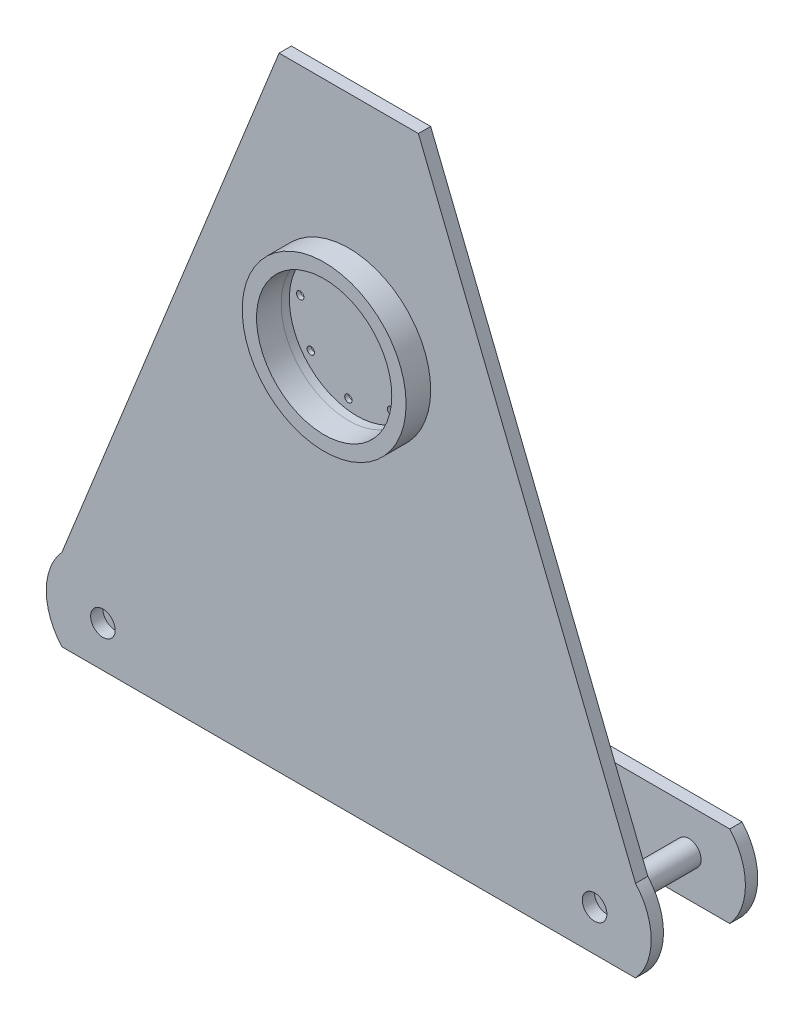
ISO-10303-21;
HEADER;
FILE_DESCRIPTION(('STEP AP214'),'2;1');
FILE_NAME('part.step','',(''),(''),'','','');
FILE_SCHEMA(('AUTOMOTIVE_DESIGN { 1 0 10303 214 1 1 1 1 }'));
ENDSEC;
DATA;
#1=APPLICATION_CONTEXT('core data for automotive mechanical design processes');
#2=APPLICATION_PROTOCOL_DEFINITION('international standard','automotive_design',2000,#1);
#3=PRODUCT_CONTEXT('',#1,'mechanical');
#4=PRODUCT('Part','Part','',(#3));
#5=PRODUCT_RELATED_PRODUCT_CATEGORY('part','',(#4));
#6=PRODUCT_DEFINITION_FORMATION('','',#4);
#7=PRODUCT_DEFINITION_CONTEXT('part definition',#1,'design');
#8=PRODUCT_DEFINITION('design','',#6,#7);
#9=PRODUCT_DEFINITION_SHAPE('','',#8);
#10=(LENGTH_UNIT() NAMED_UNIT(*) SI_UNIT(.MILLI.,.METRE.));
#11=(NAMED_UNIT(*) PLANE_ANGLE_UNIT() SI_UNIT($,.RADIAN.));
#12=(NAMED_UNIT(*) SI_UNIT($,.STERADIAN.) SOLID_ANGLE_UNIT());
#13=UNCERTAINTY_MEASURE_WITH_UNIT(LENGTH_MEASURE(1.E-05),#10,'distance_accuracy_value','');
#14=(GEOMETRIC_REPRESENTATION_CONTEXT(3) GLOBAL_UNCERTAINTY_ASSIGNED_CONTEXT((#13)) GLOBAL_UNIT_ASSIGNED_CONTEXT((#10,
#11,#12)) REPRESENTATION_CONTEXT('',''));
#15=CARTESIAN_POINT('',(0.,0.,0.));
#16=DIRECTION('',(0.,0.,1.));
#17=DIRECTION('',(1.,0.,0.));
#18=AXIS2_PLACEMENT_3D('',#15,#16,#17);
#19=CARTESIAN_POINT('',(0.,446.48,160.));
#20=DIRECTION('',(0.,0.,1.));
#21=DIRECTION('',(1.,0.,0.));
#22=AXIS2_PLACEMENT_3D('',#19,#20,#21);
#23=PLANE('',#22);
#24=CARTESIAN_POINT('',(0.,446.48,160.));
#25=DIRECTION('',(0.,0.,1.));
#26=DIRECTION('',(1.,0.,0.));
#27=AXIS2_PLACEMENT_3D('',#24,#25,#26);
#28=CIRCLE('',#27,100.);
#29=CARTESIAN_POINT('',(100.,446.48,160.));
#30=VERTEX_POINT('',#29);
#31=EDGE_CURVE('E11',#30,#30,#28,.T.);
#32=ORIENTED_EDGE('',*,*,#31,.T.);
#33=EDGE_LOOP('',(#32));
#34=FACE_BOUND('',#33,.T.);
#35=CARTESIAN_POINT('',(0.,446.48,160.));
#36=DIRECTION('',(0.,0.,1.));
#37=DIRECTION('',(1.,0.,0.));
#38=AXIS2_PLACEMENT_3D('',#35,#36,#37);
#39=CIRCLE('',#38,82.5);
#40=CARTESIAN_POINT('',(82.5,446.48,160.));
#41=VERTEX_POINT('',#40);
#42=EDGE_CURVE('E60',#41,#41,#39,.T.);
#43=ORIENTED_EDGE('',*,*,#42,.F.);
#44=EDGE_LOOP('',(#43));
#45=FACE_BOUND('',#44,.T.);
#46=ADVANCED_FACE('F49',(#34,#45),#23,.T.);
#47=CARTESIAN_POINT('',(0.,446.48,130.));
#48=DIRECTION('',(0.,0.,1.));
#49=DIRECTION('',(1.,0.,0.));
#50=AXIS2_PLACEMENT_3D('',#47,#48,#49);
#51=PLANE('',#50);
#52=CARTESIAN_POINT('',(0.,446.48,130.));
#53=DIRECTION('',(0.,0.,1.));
#54=DIRECTION('',(1.,0.,0.));
#55=AXIS2_PLACEMENT_3D('',#52,#53,#54);
#56=CIRCLE('',#55,100.);
#57=CARTESIAN_POINT('',(100.,446.48,130.));
#58=VERTEX_POINT('',#57);
#59=EDGE_CURVE('E53',#58,#58,#56,.T.);
#60=ORIENTED_EDGE('',*,*,#59,.F.);
#61=EDGE_LOOP('',(#60));
#62=FACE_BOUND('',#61,.T.);
#63=CARTESIAN_POINT('',(0.,446.48,130.));
#64=DIRECTION('',(0.,0.,1.));
#65=DIRECTION('',(1.,0.,0.));
#66=AXIS2_PLACEMENT_3D('',#63,#64,#65);
#67=CIRCLE('',#66,82.5);
#68=CARTESIAN_POINT('',(82.5,446.48,130.));
#69=VERTEX_POINT('',#68);
#70=EDGE_CURVE('E62',#69,#69,#67,.T.);
#71=ORIENTED_EDGE('',*,*,#70,.T.);
#72=EDGE_LOOP('',(#71));
#73=FACE_BOUND('',#72,.T.);
#74=ADVANCED_FACE('F72',(#62,#73),#51,.F.);
#75=CARTESIAN_POINT('',(0.,446.48,160.));
#76=DIRECTION('',(0.,0.,-1.));
#77=DIRECTION('',(-1.,0.,0.));
#78=AXIS2_PLACEMENT_3D('',#75,#76,#77);
#79=CYLINDRICAL_SURFACE('',#78,100.);
#80=ORIENTED_EDGE('',*,*,#31,.F.);
#81=EDGE_LOOP('',(#80));
#82=FACE_BOUND('',#81,.T.);
#83=ORIENTED_EDGE('',*,*,#59,.T.);
#84=EDGE_LOOP('',(#83));
#85=FACE_BOUND('',#84,.T.);
#86=ADVANCED_FACE('F51',(#82,#85),#79,.T.);
#87=CARTESIAN_POINT('',(0.,446.48,160.));
#88=DIRECTION('',(0.,0.,-1.));
#89=DIRECTION('',(-1.,0.,0.));
#90=AXIS2_PLACEMENT_3D('',#87,#88,#89);
#91=CYLINDRICAL_SURFACE('',#90,82.5);
#92=ORIENTED_EDGE('',*,*,#42,.T.);
#93=EDGE_LOOP('',(#92));
#94=FACE_BOUND('',#93,.T.);
#95=ORIENTED_EDGE('',*,*,#70,.F.);
#96=EDGE_LOOP('',(#95));
#97=FACE_BOUND('',#96,.T.);
#98=ADVANCED_FACE('F68',(#94,#97),#91,.F.);
#99=CLOSED_SHELL('',(#46,#74,#86,#98));
#100=MANIFOLD_SOLID_BREP('B2',#99);
#101=CARTESIAN_POINT('',(300.,0.,115.));
#102=DIRECTION('',(0.,0.,-1.));
#103=DIRECTION('',(-1.,0.,0.));
#104=AXIS2_PLACEMENT_3D('',#101,#102,#103);
#105=CYLINDRICAL_SURFACE('',#104,15.);
#106=CARTESIAN_POINT('',(300.,0.,115.));
#107=DIRECTION('',(0.,0.,1.));
#108=DIRECTION('',(1.,0.,0.));
#109=AXIS2_PLACEMENT_3D('',#106,#107,#108);
#110=CIRCLE('',#109,15.);
#111=CARTESIAN_POINT('',(315.,0.,115.));
#112=VERTEX_POINT('',#111);
#113=EDGE_CURVE('E48',#112,#112,#110,.T.);
#114=ORIENTED_EDGE('',*,*,#113,.F.);
#115=EDGE_LOOP('',(#114));
#116=FACE_BOUND('',#115,.T.);
#117=CARTESIAN_POINT('',(300.,0.,15.));
#118=DIRECTION('',(0.,0.,1.));
#119=DIRECTION('',(1.,0.,0.));
#120=AXIS2_PLACEMENT_3D('',#117,#118,#119);
#121=CIRCLE('',#120,15.);
#122=CARTESIAN_POINT('',(315.,0.,15.));
#123=VERTEX_POINT('',#122);
#124=EDGE_CURVE('E121',#123,#123,#121,.T.);
#125=ORIENTED_EDGE('',*,*,#124,.T.);
#126=EDGE_LOOP('',(#125));
#127=FACE_BOUND('',#126,.T.);
#128=ADVANCED_FACE('F118',(#116,#127),#105,.T.);
#129=CARTESIAN_POINT('',(300.,0.,115.));
#130=DIRECTION('',(0.,0.,1.));
#131=DIRECTION('',(1.,0.,0.));
#132=AXIS2_PLACEMENT_3D('',#129,#130,#131);
#133=PLANE('',#132);
#134=ORIENTED_EDGE('',*,*,#113,.T.);
#135=EDGE_LOOP('',(#134));
#136=FACE_BOUND('',#135,.T.);
#137=ADVANCED_FACE('F133',(#136),#133,.T.);
#138=CARTESIAN_POINT('',(300.,0.,15.));
#139=DIRECTION('',(0.,0.,1.));
#140=DIRECTION('',(1.,0.,0.));
#141=AXIS2_PLACEMENT_3D('',#138,#139,#140);
#142=PLANE('',#141);
#143=ORIENTED_EDGE('',*,*,#124,.F.);
#144=EDGE_LOOP('',(#143));
#145=FACE_BOUND('',#144,.T.);
#146=ADVANCED_FACE('F131',(#145),#142,.F.);
#147=CLOSED_SHELL('',(#128,#137,#146));
#148=MANIFOLD_SOLID_BREP('B6',#147);
#149=CARTESIAN_POINT('',(-300.,0.,115.));
#150=DIRECTION('',(0.,0.,-1.));
#151=DIRECTION('',(-1.,0.,0.));
#152=AXIS2_PLACEMENT_3D('',#149,#150,#151);
#153=CYLINDRICAL_SURFACE('',#152,15.);
#154=CARTESIAN_POINT('',(-300.,0.,115.));
#155=DIRECTION('',(0.,0.,1.));
#156=DIRECTION('',(1.,0.,0.));
#157=AXIS2_PLACEMENT_3D('',#154,#155,#156);
#158=CIRCLE('',#157,15.);
#159=CARTESIAN_POINT('',(-285.,0.,115.));
#160=VERTEX_POINT('',#159);
#161=EDGE_CURVE('E117',#160,#160,#158,.T.);
#162=ORIENTED_EDGE('',*,*,#161,.F.);
#163=EDGE_LOOP('',(#162));
#164=FACE_BOUND('',#163,.T.);
#165=CARTESIAN_POINT('',(-300.,0.,15.));
#166=DIRECTION('',(0.,0.,1.));
#167=DIRECTION('',(1.,0.,0.));
#168=AXIS2_PLACEMENT_3D('',#165,#166,#167);
#169=CIRCLE('',#168,15.);
#170=CARTESIAN_POINT('',(-285.,0.,15.));
#171=VERTEX_POINT('',#170);
#172=EDGE_CURVE('E171',#171,#171,#169,.T.);
#173=ORIENTED_EDGE('',*,*,#172,.T.);
#174=EDGE_LOOP('',(#173));
#175=FACE_BOUND('',#174,.T.);
#176=ADVANCED_FACE('F168',(#164,#175),#153,.T.);
#177=CARTESIAN_POINT('',(-300.,0.,115.));
#178=DIRECTION('',(0.,0.,1.));
#179=DIRECTION('',(1.,0.,0.));
#180=AXIS2_PLACEMENT_3D('',#177,#178,#179);
#181=PLANE('',#180);
#182=ORIENTED_EDGE('',*,*,#161,.T.);
#183=EDGE_LOOP('',(#182));
#184=FACE_BOUND('',#183,.T.);
#185=ADVANCED_FACE('F183',(#184),#181,.T.);
#186=CARTESIAN_POINT('',(-300.,0.,15.));
#187=DIRECTION('',(0.,0.,1.));
#188=DIRECTION('',(1.,0.,0.));
#189=AXIS2_PLACEMENT_3D('',#186,#187,#188);
#190=PLANE('',#189);
#191=ORIENTED_EDGE('',*,*,#172,.F.);
#192=EDGE_LOOP('',(#191));
#193=FACE_BOUND('',#192,.T.);
#194=ADVANCED_FACE('F181',(#193),#190,.F.);
#195=CLOSED_SHELL('',(#176,#185,#194));
#196=MANIFOLD_SOLID_BREP('B43',#195);
#197=CARTESIAN_POINT('',(0.,-50.,130.));
#198=DIRECTION('',(0.,1.,0.));
#199=DIRECTION('',(-1.,0.,0.));
#200=AXIS2_PLACEMENT_3D('',#197,#198,#199);
#201=PLANE('',#200);
#202=DIRECTION('',(1.,0.,0.));
#203=VECTOR('',#202,1.);
#204=CARTESIAN_POINT('',(0.,-50.,115.));
#205=LINE('',#204,#203);
#206=CARTESIAN_POINT('',(-350.,-49.9999999999999,115.));
#207=VERTEX_POINT('',#206);
#208=CARTESIAN_POINT('',(350.,-50.,115.));
#209=VERTEX_POINT('',#208);
#210=EDGE_CURVE('E342',#207,#209,#205,.T.);
#211=ORIENTED_EDGE('',*,*,#210,.T.);
#212=DIRECTION('',(0.,0.,-1.));
#213=VECTOR('',#212,1.);
#214=CARTESIAN_POINT('',(350.,-50.,130.));
#215=LINE('',#214,#213);
#216=CARTESIAN_POINT('',(350.,-50.,130.));
#217=VERTEX_POINT('',#216);
#218=EDGE_CURVE('E166',#217,#209,#215,.T.);
#219=ORIENTED_EDGE('',*,*,#218,.F.);
#220=DIRECTION('',(1.,0.,0.));
#221=VECTOR('',#220,1.);
#222=CARTESIAN_POINT('',(0.,-50.,130.));
#223=LINE('',#222,#221);
#224=CARTESIAN_POINT('',(-350.,-49.9999999999999,130.));
#225=VERTEX_POINT('',#224);
#226=EDGE_CURVE('E257',#225,#217,#223,.T.);
#227=ORIENTED_EDGE('',*,*,#226,.F.);
#228=DIRECTION('',(0.,0.,-1.));
#229=VECTOR('',#228,1.);
#230=CARTESIAN_POINT('',(-350.,-49.9999999999999,130.));
#231=LINE('',#230,#229);
#232=EDGE_CURVE('E334',#225,#207,#231,.T.);
#233=ORIENTED_EDGE('',*,*,#232,.T.);
#234=EDGE_LOOP('',(#211,#219,#227,#233));
#235=FACE_BOUND('',#234,.T.);
#236=ADVANCED_FACE('F217',(#235),#201,.F.);
#237=CARTESIAN_POINT('',(294.098300562506,0.,130.));
#238=DIRECTION('',(0.,0.,-1.));
#239=DIRECTION('',(-1.,0.,0.));
#240=AXIS2_PLACEMENT_3D('',#237,#238,#239);
#241=CYLINDRICAL_SURFACE('',#240,75.);
#242=CARTESIAN_POINT('',(294.098300562506,0.,115.));
#243=DIRECTION('',(0.,0.,1.));
#244=DIRECTION('',(1.,0.,0.));
#245=AXIS2_PLACEMENT_3D('',#242,#243,#244);
#246=CIRCLE('',#245,75.);
#247=CARTESIAN_POINT('',(350.,50.,115.));
#248=VERTEX_POINT('',#247);
#249=EDGE_CURVE('E346',#248,#209,#246,.F.);
#250=ORIENTED_EDGE('',*,*,#249,.F.);
#251=DIRECTION('',(0.,0.,-1.));
#252=VECTOR('',#251,1.);
#253=CARTESIAN_POINT('',(350.,50.,130.));
#254=LINE('',#253,#252);
#255=CARTESIAN_POINT('',(350.,50.,130.));
#256=VERTEX_POINT('',#255);
#257=EDGE_CURVE('E228',#256,#248,#254,.T.);
#258=ORIENTED_EDGE('',*,*,#257,.F.);
#259=CARTESIAN_POINT('',(294.098300562506,0.,130.));
#260=DIRECTION('',(0.,0.,1.));
#261=DIRECTION('',(1.,0.,0.));
#262=AXIS2_PLACEMENT_3D('',#259,#260,#261);
#263=CIRCLE('',#262,75.);
#264=EDGE_CURVE('E301',#256,#217,#263,.F.);
#265=ORIENTED_EDGE('',*,*,#264,.T.);
#266=ORIENTED_EDGE('',*,*,#218,.T.);
#267=EDGE_LOOP('',(#250,#258,#265,#266));
#268=FACE_BOUND('',#267,.T.);
#269=ADVANCED_FACE('F358',(#268),#241,.T.);
#270=CARTESIAN_POINT('',(-300.,0.,130.));
#271=DIRECTION('',(0.,0.,-1.));
#272=DIRECTION('',(-1.,0.,0.));
#273=AXIS2_PLACEMENT_3D('',#270,#271,#272);
#274=CYLINDRICAL_SURFACE('',#273,15.);
#275=CARTESIAN_POINT('',(-300.,0.,130.));
#276=DIRECTION('',(0.,0.,1.));
#277=DIRECTION('',(1.,0.,0.));
#278=AXIS2_PLACEMENT_3D('',#275,#276,#277);
#279=CIRCLE('',#278,15.);
#280=CARTESIAN_POINT('',(-285.,0.,130.));
#281=VERTEX_POINT('',#280);
#282=EDGE_CURVE('E324',#281,#281,#279,.T.);
#283=ORIENTED_EDGE('',*,*,#282,.T.);
#284=EDGE_LOOP('',(#283));
#285=FACE_BOUND('',#284,.T.);
#286=CARTESIAN_POINT('',(-300.,0.,115.));
#287=DIRECTION('',(0.,0.,1.));
#288=DIRECTION('',(1.,0.,0.));
#289=AXIS2_PLACEMENT_3D('',#286,#287,#288);
#290=CIRCLE('',#289,15.);
#291=CARTESIAN_POINT('',(-285.,0.,115.));
#292=VERTEX_POINT('',#291);
#293=EDGE_CURVE('E338',#292,#292,#290,.T.);
#294=ORIENTED_EDGE('',*,*,#293,.F.);
#295=EDGE_LOOP('',(#294));
#296=FACE_BOUND('',#295,.T.);
#297=ADVANCED_FACE('F477',(#285,#296),#274,.F.);
#298=CARTESIAN_POINT('',(300.,0.,130.));
#299=DIRECTION('',(0.,0.,-1.));
#300=DIRECTION('',(-1.,0.,0.));
#301=AXIS2_PLACEMENT_3D('',#298,#299,#300);
#302=CYLINDRICAL_SURFACE('',#301,15.);
#303=CARTESIAN_POINT('',(300.,0.,130.));
#304=DIRECTION('',(0.,0.,1.));
#305=DIRECTION('',(1.,0.,0.));
#306=AXIS2_PLACEMENT_3D('',#303,#304,#305);
#307=CIRCLE('',#306,15.);
#308=CARTESIAN_POINT('',(315.,0.,130.));
#309=VERTEX_POINT('',#308);
#310=EDGE_CURVE('E320',#309,#309,#307,.T.);
#311=ORIENTED_EDGE('',*,*,#310,.T.);
#312=EDGE_LOOP('',(#311));
#313=FACE_BOUND('',#312,.T.);
#314=CARTESIAN_POINT('',(300.,0.,115.));
#315=DIRECTION('',(0.,0.,1.));
#316=DIRECTION('',(1.,0.,0.));
#317=AXIS2_PLACEMENT_3D('',#314,#315,#316);
#318=CIRCLE('',#317,15.);
#319=CARTESIAN_POINT('',(315.,0.,115.));
#320=VERTEX_POINT('',#319);
#321=EDGE_CURVE('E319',#320,#320,#318,.T.);
#322=ORIENTED_EDGE('',*,*,#321,.F.);
#323=EDGE_LOOP('',(#322));
#324=FACE_BOUND('',#323,.T.);
#325=ADVANCED_FACE('F219',(#313,#324),#302,.F.);
#326=CARTESIAN_POINT('',(-294.098300562505,0.,130.));
#327=DIRECTION('',(0.,0.,-1.));
#328=DIRECTION('',(-1.,0.,0.));
#329=AXIS2_PLACEMENT_3D('',#326,#327,#328);
#330=CYLINDRICAL_SURFACE('',#329,75.);
#331=CARTESIAN_POINT('',(-294.098300562505,0.,115.));
#332=DIRECTION('',(0.,0.,1.));
#333=DIRECTION('',(1.,0.,0.));
#334=AXIS2_PLACEMENT_3D('',#331,#332,#333);
#335=CIRCLE('',#334,75.);
#336=CARTESIAN_POINT('',(-350.,50.,115.));
#337=VERTEX_POINT('',#336);
#338=EDGE_CURVE('E252',#337,#207,#335,.T.);
#339=ORIENTED_EDGE('',*,*,#338,.T.);
#340=ORIENTED_EDGE('',*,*,#232,.F.);
#341=CARTESIAN_POINT('',(-294.098300562505,0.,130.));
#342=DIRECTION('',(0.,0.,1.));
#343=DIRECTION('',(1.,0.,0.));
#344=AXIS2_PLACEMENT_3D('',#341,#342,#343);
#345=CIRCLE('',#344,75.);
#346=CARTESIAN_POINT('',(-350.,50.,130.));
#347=VERTEX_POINT('',#346);
#348=EDGE_CURVE('E236',#347,#225,#345,.T.);
#349=ORIENTED_EDGE('',*,*,#348,.F.);
#350=DIRECTION('',(0.,0.,-1.));
#351=VECTOR('',#350,1.);
#352=CARTESIAN_POINT('',(-350.,50.,130.));
#353=LINE('',#352,#351);
#354=EDGE_CURVE('E249',#347,#337,#353,.T.);
#355=ORIENTED_EDGE('',*,*,#354,.T.);
#356=EDGE_LOOP('',(#339,#340,#349,#355));
#357=FACE_BOUND('',#356,.T.);
#358=ADVANCED_FACE('F471',(#357),#330,.T.);
#359=CARTESIAN_POINT('',(0.,0.,130.));
#360=DIRECTION('',(0.,0.,1.));
#361=DIRECTION('',(1.,0.,0.));
#362=AXIS2_PLACEMENT_3D('',#359,#360,#361);
#363=PLANE('',#362);
#364=CARTESIAN_POINT('',(0.,446.48,130.));
#365=DIRECTION('',(0.,0.,1.));
#366=DIRECTION('',(1.,0.,0.));
#367=AXIS2_PLACEMENT_3D('',#364,#365,#366);
#368=CIRCLE('',#367,82.5);
#369=CARTESIAN_POINT('',(82.5,446.48,130.));
#370=VERTEX_POINT('',#369);
#371=EDGE_CURVE('E303',#370,#370,#368,.T.);
#372=ORIENTED_EDGE('',*,*,#371,.F.);
#373=EDGE_LOOP('',(#372));
#374=FACE_BOUND('',#373,.T.);
#375=ORIENTED_EDGE('',*,*,#310,.F.);
#376=EDGE_LOOP('',(#375));
#377=FACE_BOUND('',#376,.T.);
#378=ORIENTED_EDGE('',*,*,#282,.F.);
#379=EDGE_LOOP('',(#378));
#380=FACE_BOUND('',#379,.T.);
#381=ORIENTED_EDGE('',*,*,#226,.T.);
#382=ORIENTED_EDGE('',*,*,#264,.F.);
#383=DIRECTION('',(-0.372602469406177,0.927991055879537,0.));
#384=VECTOR('',#383,1.);
#385=CARTESIAN_POINT('',(350.,50.,130.));
#386=LINE('',#385,#384);
#387=CARTESIAN_POINT('',(85.,710.,130.));
#388=VERTEX_POINT('',#387);
#389=EDGE_CURVE('E283',#256,#388,#386,.T.);
#390=ORIENTED_EDGE('',*,*,#389,.T.);
#391=DIRECTION('',(-1.,0.,0.));
#392=VECTOR('',#391,1.);
#393=CARTESIAN_POINT('',(-85.,710.,130.));
#394=LINE('',#393,#392);
#395=CARTESIAN_POINT('',(-85.,710.,130.));
#396=VERTEX_POINT('',#395);
#397=EDGE_CURVE('E293',#388,#396,#394,.T.);
#398=ORIENTED_EDGE('',*,*,#397,.T.);
#399=DIRECTION('',(-0.372602469406177,-0.927991055879537,0.));
#400=VECTOR('',#399,1.);
#401=CARTESIAN_POINT('',(-350.,50.,130.));
#402=LINE('',#401,#400);
#403=EDGE_CURVE('E290',#396,#347,#402,.T.);
#404=ORIENTED_EDGE('',*,*,#403,.T.);
#405=ORIENTED_EDGE('',*,*,#348,.T.);
#406=EDGE_LOOP('',(#381,#382,#390,#398,#404,#405));
#407=FACE_BOUND('',#406,.T.);
#408=ADVANCED_FACE('F299',(#374,#377,#380,#407),#363,.T.);
#409=CARTESIAN_POINT('',(0.,0.,115.));
#410=DIRECTION('',(0.,0.,1.));
#411=DIRECTION('',(1.,0.,0.));
#412=AXIS2_PLACEMENT_3D('',#409,#410,#411);
#413=PLANE('',#412);
#414=CARTESIAN_POINT('',(-69.2210768489239,456.893573828199,115.));
#415=DIRECTION('',(0.,0.,1.));
#416=DIRECTION('',(0.707106781186546,-0.707106781186549,0.));
#417=AXIS2_PLACEMENT_3D('',#414,#415,#416);
#418=CIRCLE('',#417,4.5);
#419=CARTESIAN_POINT('',(-66.0390963335844,453.71159331286,115.));
#420=VERTEX_POINT('',#419);
#421=EDGE_CURVE('E374',#420,#420,#418,.T.);
#422=ORIENTED_EDGE('',*,*,#421,.T.);
#423=EDGE_LOOP('',(#422));
#424=FACE_BOUND('',#423,.T.);
#425=CARTESIAN_POINT('',(-41.5831841706026,502.790201511216,115.));
#426=DIRECTION('',(0.,0.,1.));
#427=DIRECTION('',(0.,-1.,0.));
#428=AXIS2_PLACEMENT_3D('',#425,#426,#427);
#429=CIRCLE('',#428,4.5);
#430=CARTESIAN_POINT('',(-41.5831841706026,498.290201511216,115.));
#431=VERTEX_POINT('',#430);
#432=EDGE_CURVE('E419',#431,#431,#429,.T.);
#433=ORIENTED_EDGE('',*,*,#432,.T.);
#434=EDGE_LOOP('',(#433));
#435=FACE_BOUND('',#434,.T.);
#436=CARTESIAN_POINT('',(10.4135738281996,515.701076848924,115.));
#437=DIRECTION('',(0.,0.,1.));
#438=DIRECTION('',(-0.707106781186551,-0.707106781186544,0.));
#439=AXIS2_PLACEMENT_3D('',#436,#437,#438);
#440=CIRCLE('',#439,4.5);
#441=CARTESIAN_POINT('',(7.23159331286015,512.519096333585,115.));
#442=VERTEX_POINT('',#441);
#443=EDGE_CURVE('E411',#442,#442,#440,.T.);
#444=ORIENTED_EDGE('',*,*,#443,.T.);
#445=EDGE_LOOP('',(#444));
#446=FACE_BOUND('',#445,.T.);
#447=CARTESIAN_POINT('',(56.3102015112158,488.063184170603,115.));
#448=DIRECTION('',(0.,0.,1.));
#449=DIRECTION('',(-1.,0.,0.));
#450=AXIS2_PLACEMENT_3D('',#447,#448,#449);
#451=CIRCLE('',#450,4.5);
#452=CARTESIAN_POINT('',(51.8102015112158,488.063184170603,115.));
#453=VERTEX_POINT('',#452);
#454=EDGE_CURVE('E403',#453,#453,#451,.T.);
#455=ORIENTED_EDGE('',*,*,#454,.T.);
#456=EDGE_LOOP('',(#455));
#457=FACE_BOUND('',#456,.T.);
#458=CARTESIAN_POINT('',(69.221076848924,436.0664261718,115.));
#459=DIRECTION('',(0.,0.,1.));
#460=DIRECTION('',(-0.707106781186541,0.707106781186554,0.));
#461=AXIS2_PLACEMENT_3D('',#458,#459,#460);
#462=CIRCLE('',#461,4.5);
#463=CARTESIAN_POINT('',(66.0390963335845,439.24840668714,115.));
#464=VERTEX_POINT('',#463);
#465=EDGE_CURVE('E395',#464,#464,#462,.T.);
#466=ORIENTED_EDGE('',*,*,#465,.T.);
#467=EDGE_LOOP('',(#466));
#468=FACE_BOUND('',#467,.T.);
#469=CARTESIAN_POINT('',(41.5831841706023,390.169798488784,115.));
#470=DIRECTION('',(0.,0.,1.));
#471=DIRECTION('',(0.,1.,0.));
#472=AXIS2_PLACEMENT_3D('',#469,#470,#471);
#473=CIRCLE('',#472,4.5);
#474=CARTESIAN_POINT('',(41.5831841706024,394.669798488784,115.));
#475=VERTEX_POINT('',#474);
#476=EDGE_CURVE('E387',#475,#475,#473,.T.);
#477=ORIENTED_EDGE('',*,*,#476,.T.);
#478=EDGE_LOOP('',(#477));
#479=FACE_BOUND('',#478,.T.);
#480=CARTESIAN_POINT('',(-10.4135738282,377.258923151076,115.));
#481=DIRECTION('',(0.,0.,1.));
#482=DIRECTION('',(0.707106781186556,0.707106781186539,0.));
#483=AXIS2_PLACEMENT_3D('',#480,#481,#482);
#484=CIRCLE('',#483,4.5);
#485=CARTESIAN_POINT('',(-7.23159331286051,380.440903666416,115.));
#486=VERTEX_POINT('',#485);
#487=EDGE_CURVE('E379',#486,#486,#484,.T.);
#488=ORIENTED_EDGE('',*,*,#487,.T.);
#489=EDGE_LOOP('',(#488));
#490=FACE_BOUND('',#489,.T.);
#491=CARTESIAN_POINT('',(-56.3102015112157,404.896815829397,115.));
#492=DIRECTION('',(0.,0.,1.));
#493=DIRECTION('',(1.,0.,0.));
#494=AXIS2_PLACEMENT_3D('',#491,#492,#493);
#495=CIRCLE('',#494,4.5);
#496=CARTESIAN_POINT('',(-51.8102015112157,404.896815829397,115.));
#497=VERTEX_POINT('',#496);
#498=EDGE_CURVE('E366',#497,#497,#495,.T.);
#499=ORIENTED_EDGE('',*,*,#498,.T.);
#500=EDGE_LOOP('',(#499));
#501=FACE_BOUND('',#500,.T.);
#502=ORIENTED_EDGE('',*,*,#321,.T.);
#503=EDGE_LOOP('',(#502));
#504=FACE_BOUND('',#503,.T.);
#505=ORIENTED_EDGE('',*,*,#293,.T.);
#506=EDGE_LOOP('',(#505));
#507=FACE_BOUND('',#506,.T.);
#508=ORIENTED_EDGE('',*,*,#210,.F.);
#509=ORIENTED_EDGE('',*,*,#338,.F.);
#510=DIRECTION('',(0.372602469406177,0.927991055879537,0.));
#511=VECTOR('',#510,1.);
#512=CARTESIAN_POINT('',(-350.,50.,115.));
#513=LINE('',#512,#511);
#514=CARTESIAN_POINT('',(-85.,710.,115.));
#515=VERTEX_POINT('',#514);
#516=EDGE_CURVE('E309',#337,#515,#513,.T.);
#517=ORIENTED_EDGE('',*,*,#516,.T.);
#518=DIRECTION('',(1.,0.,0.));
#519=VECTOR('',#518,1.);
#520=CARTESIAN_POINT('',(-85.,710.,115.));
#521=LINE('',#520,#519);
#522=CARTESIAN_POINT('',(85.,710.,115.));
#523=VERTEX_POINT('',#522);
#524=EDGE_CURVE('E315',#515,#523,#521,.T.);
#525=ORIENTED_EDGE('',*,*,#524,.T.);
#526=DIRECTION('',(0.372602469406177,-0.927991055879537,0.));
#527=VECTOR('',#526,1.);
#528=CARTESIAN_POINT('',(350.,50.,115.));
#529=LINE('',#528,#527);
#530=EDGE_CURVE('E285',#523,#248,#529,.T.);
#531=ORIENTED_EDGE('',*,*,#530,.T.);
#532=ORIENTED_EDGE('',*,*,#249,.T.);
#533=EDGE_LOOP('',(#508,#509,#517,#525,#531,#532));
#534=FACE_BOUND('',#533,.T.);
#535=ADVANCED_FACE('F361',(#424,#435,#446,#457,#468,#479,#490,#501,#504,#507,#534),#413,.F.);
#536=CARTESIAN_POINT('',(-350.,50.,-847.081077664455));
#537=DIRECTION('',(-0.927991055879537,0.372602469406177,0.));
#538=DIRECTION('',(-0.372602469406177,-0.927991055879537,0.));
#539=AXIS2_PLACEMENT_3D('',#536,#537,#538);
#540=PLANE('',#539);
#541=ORIENTED_EDGE('',*,*,#516,.F.);
#542=ORIENTED_EDGE('',*,*,#354,.F.);
#543=ORIENTED_EDGE('',*,*,#403,.F.);
#544=DIRECTION('',(0.,0.,1.));
#545=VECTOR('',#544,1.);
#546=CARTESIAN_POINT('',(-85.,710.,-847.081077664455));
#547=LINE('',#546,#545);
#548=EDGE_CURVE('E289',#515,#396,#547,.T.);
#549=ORIENTED_EDGE('',*,*,#548,.F.);
#550=EDGE_LOOP('',(#541,#542,#543,#549));
#551=FACE_BOUND('',#550,.T.);
#552=ADVANCED_FACE('F483',(#551),#540,.T.);
#553=CARTESIAN_POINT('',(-85.,710.,-847.081077664455));
#554=DIRECTION('',(0.,1.,0.));
#555=DIRECTION('',(0.,0.,1.));
#556=AXIS2_PLACEMENT_3D('',#553,#554,#555);
#557=PLANE('',#556);
#558=ORIENTED_EDGE('',*,*,#524,.F.);
#559=ORIENTED_EDGE('',*,*,#548,.T.);
#560=ORIENTED_EDGE('',*,*,#397,.F.);
#561=DIRECTION('',(0.,0.,1.));
#562=VECTOR('',#561,1.);
#563=CARTESIAN_POINT('',(85.,710.,-847.081077664455));
#564=LINE('',#563,#562);
#565=EDGE_CURVE('E278',#523,#388,#564,.T.);
#566=ORIENTED_EDGE('',*,*,#565,.F.);
#567=EDGE_LOOP('',(#558,#559,#560,#566));
#568=FACE_BOUND('',#567,.T.);
#569=ADVANCED_FACE('F294',(#568),#557,.T.);
#570=CARTESIAN_POINT('',(350.,50.,-847.081077664455));
#571=DIRECTION('',(0.927991055879537,0.372602469406177,0.));
#572=DIRECTION('',(-0.372602469406177,0.927991055879537,0.));
#573=AXIS2_PLACEMENT_3D('',#570,#571,#572);
#574=PLANE('',#573);
#575=ORIENTED_EDGE('',*,*,#530,.F.);
#576=ORIENTED_EDGE('',*,*,#565,.T.);
#577=ORIENTED_EDGE('',*,*,#389,.F.);
#578=ORIENTED_EDGE('',*,*,#257,.T.);
#579=EDGE_LOOP('',(#575,#576,#577,#578));
#580=FACE_BOUND('',#579,.T.);
#581=ADVANCED_FACE('F280',(#580),#574,.T.);
#582=CARTESIAN_POINT('',(0.,446.48,0.));
#583=DIRECTION('',(0.,0.,1.));
#584=DIRECTION('',(1.,0.,0.));
#585=AXIS2_PLACEMENT_3D('',#582,#583,#584);
#586=CYLINDRICAL_SURFACE('',#585,82.5);
#587=CARTESIAN_POINT('',(0.,446.48,120.));
#588=DIRECTION('',(0.,0.,1.));
#589=DIRECTION('',(1.,0.,0.));
#590=AXIS2_PLACEMENT_3D('',#587,#588,#589);
#591=CIRCLE('',#590,82.5);
#592=CARTESIAN_POINT('',(82.5,446.48,120.));
#593=VERTEX_POINT('',#592);
#594=EDGE_CURVE('E221',#593,#593,#591,.F.);
#595=ORIENTED_EDGE('',*,*,#594,.T.);
#596=EDGE_LOOP('',(#595));
#597=FACE_BOUND('',#596,.T.);
#598=ORIENTED_EDGE('',*,*,#371,.T.);
#599=EDGE_LOOP('',(#598));
#600=FACE_BOUND('',#599,.T.);
#601=ADVANCED_FACE('F444',(#597,#600),#586,.F.);
#602=CARTESIAN_POINT('',(0.,446.48,120.));
#603=DIRECTION('',(0.,0.,1.));
#604=DIRECTION('',(1.,0.,0.));
#605=AXIS2_PLACEMENT_3D('',#602,#603,#604);
#606=PLANE('',#605);
#607=CARTESIAN_POINT('',(-69.2210768489239,456.893573828199,120.));
#608=DIRECTION('',(0.,0.,1.));
#609=DIRECTION('',(0.707106781186546,-0.707106781186549,0.));
#610=AXIS2_PLACEMENT_3D('',#607,#608,#609);
#611=CIRCLE('',#610,4.5);
#612=CARTESIAN_POINT('',(-66.0390963335844,453.71159331286,120.));
#613=VERTEX_POINT('',#612);
#614=EDGE_CURVE('E423',#613,#613,#611,.T.);
#615=ORIENTED_EDGE('',*,*,#614,.F.);
#616=EDGE_LOOP('',(#615));
#617=FACE_BOUND('',#616,.T.);
#618=CARTESIAN_POINT('',(-41.5831841706026,502.790201511216,120.));
#619=DIRECTION('',(0.,0.,1.));
#620=DIRECTION('',(0.,-1.,0.));
#621=AXIS2_PLACEMENT_3D('',#618,#619,#620);
#622=CIRCLE('',#621,4.5);
#623=CARTESIAN_POINT('',(-41.5831841706026,498.290201511216,120.));
#624=VERTEX_POINT('',#623);
#625=EDGE_CURVE('E415',#624,#624,#622,.T.);
#626=ORIENTED_EDGE('',*,*,#625,.F.);
#627=EDGE_LOOP('',(#626));
#628=FACE_BOUND('',#627,.T.);
#629=CARTESIAN_POINT('',(10.4135738281996,515.701076848924,120.));
#630=DIRECTION('',(0.,0.,1.));
#631=DIRECTION('',(-0.707106781186551,-0.707106781186544,0.));
#632=AXIS2_PLACEMENT_3D('',#629,#630,#631);
#633=CIRCLE('',#632,4.5);
#634=CARTESIAN_POINT('',(7.23159331286015,512.519096333585,120.));
#635=VERTEX_POINT('',#634);
#636=EDGE_CURVE('E407',#635,#635,#633,.T.);
#637=ORIENTED_EDGE('',*,*,#636,.F.);
#638=EDGE_LOOP('',(#637));
#639=FACE_BOUND('',#638,.T.);
#640=CARTESIAN_POINT('',(56.3102015112158,488.063184170603,120.));
#641=DIRECTION('',(0.,0.,1.));
#642=DIRECTION('',(-1.,0.,0.));
#643=AXIS2_PLACEMENT_3D('',#640,#641,#642);
#644=CIRCLE('',#643,4.5);
#645=CARTESIAN_POINT('',(51.8102015112158,488.063184170603,120.));
#646=VERTEX_POINT('',#645);
#647=EDGE_CURVE('E399',#646,#646,#644,.T.);
#648=ORIENTED_EDGE('',*,*,#647,.F.);
#649=EDGE_LOOP('',(#648));
#650=FACE_BOUND('',#649,.T.);
#651=CARTESIAN_POINT('',(69.221076848924,436.0664261718,120.));
#652=DIRECTION('',(0.,0.,1.));
#653=DIRECTION('',(-0.707106781186541,0.707106781186554,0.));
#654=AXIS2_PLACEMENT_3D('',#651,#652,#653);
#655=CIRCLE('',#654,4.5);
#656=CARTESIAN_POINT('',(66.0390963335845,439.24840668714,120.));
#657=VERTEX_POINT('',#656);
#658=EDGE_CURVE('E391',#657,#657,#655,.T.);
#659=ORIENTED_EDGE('',*,*,#658,.F.);
#660=EDGE_LOOP('',(#659));
#661=FACE_BOUND('',#660,.T.);
#662=CARTESIAN_POINT('',(41.5831841706023,390.169798488784,120.));
#663=DIRECTION('',(0.,0.,1.));
#664=DIRECTION('',(0.,1.,0.));
#665=AXIS2_PLACEMENT_3D('',#662,#663,#664);
#666=CIRCLE('',#665,4.5);
#667=CARTESIAN_POINT('',(41.5831841706024,394.669798488784,120.));
#668=VERTEX_POINT('',#667);
#669=EDGE_CURVE('E383',#668,#668,#666,.T.);
#670=ORIENTED_EDGE('',*,*,#669,.F.);
#671=EDGE_LOOP('',(#670));
#672=FACE_BOUND('',#671,.T.);
#673=CARTESIAN_POINT('',(-10.4135738282,377.258923151076,120.));
#674=DIRECTION('',(0.,0.,1.));
#675=DIRECTION('',(0.707106781186556,0.707106781186539,0.));
#676=AXIS2_PLACEMENT_3D('',#673,#674,#675);
#677=CIRCLE('',#676,4.5);
#678=CARTESIAN_POINT('',(-7.23159331286051,380.440903666416,120.));
#679=VERTEX_POINT('',#678);
#680=EDGE_CURVE('E375',#679,#679,#677,.T.);
#681=ORIENTED_EDGE('',*,*,#680,.F.);
#682=EDGE_LOOP('',(#681));
#683=FACE_BOUND('',#682,.T.);
#684=CARTESIAN_POINT('',(-56.3102015112157,404.896815829397,120.));
#685=DIRECTION('',(0.,0.,1.));
#686=DIRECTION('',(1.,0.,0.));
#687=AXIS2_PLACEMENT_3D('',#684,#685,#686);
#688=CIRCLE('',#687,4.5);
#689=CARTESIAN_POINT('',(-51.8102015112157,404.896815829397,120.));
#690=VERTEX_POINT('',#689);
#691=EDGE_CURVE('E370',#690,#690,#688,.T.);
#692=ORIENTED_EDGE('',*,*,#691,.F.);
#693=EDGE_LOOP('',(#692));
#694=FACE_BOUND('',#693,.T.);
#695=ORIENTED_EDGE('',*,*,#594,.F.);
#696=EDGE_LOOP('',(#695));
#697=FACE_BOUND('',#696,.T.);
#698=ADVANCED_FACE('F440',(#617,#628,#639,#650,#661,#672,#683,#694,#697),#606,.T.);
#699=CARTESIAN_POINT('',(-56.3102015112157,404.896815829397,0.));
#700=DIRECTION('',(0.,0.,1.));
#701=DIRECTION('',(1.,0.,0.));
#702=AXIS2_PLACEMENT_3D('',#699,#700,#701);
#703=CYLINDRICAL_SURFACE('',#702,4.5);
#704=CARTESIAN_POINT('',(-51.8102015112157,404.896815829397,120.));
#705=CARTESIAN_POINT('',(-51.8102015112157,404.896815829397,119.947916666667));
#706=CARTESIAN_POINT('',(-51.8102015112157,404.896815829397,119.895833333333));
#707=CARTESIAN_POINT('',(-51.8102015112157,404.896815829397,119.791666666667));
#708=CARTESIAN_POINT('',(-51.8102015112157,404.896815829397,119.739583333333));
#709=CARTESIAN_POINT('',(-51.8102015112157,404.896815829397,119.635416666667));
#710=CARTESIAN_POINT('',(-51.8102015112157,404.896815829397,119.583333333333));
#711=CARTESIAN_POINT('',(-51.8102015112157,404.896815829397,119.479166666667));
#712=CARTESIAN_POINT('',(-51.8102015112157,404.896815829397,119.427083333333));
#713=CARTESIAN_POINT('',(-51.8102015112157,404.896815829397,119.322916666667));
#714=CARTESIAN_POINT('',(-51.8102015112157,404.896815829397,119.270833333333));
#715=CARTESIAN_POINT('',(-51.8102015112157,404.896815829397,119.166666666667));
#716=CARTESIAN_POINT('',(-51.8102015112157,404.896815829397,119.114583333333));
#717=CARTESIAN_POINT('',(-51.8102015112157,404.896815829397,119.010416666667));
#718=CARTESIAN_POINT('',(-51.8102015112157,404.896815829397,118.958333333333));
#719=CARTESIAN_POINT('',(-51.8102015112157,404.896815829397,118.854166666667));
#720=CARTESIAN_POINT('',(-51.8102015112157,404.896815829397,118.802083333333));
#721=CARTESIAN_POINT('',(-51.8102015112157,404.896815829397,118.697916666667));
#722=CARTESIAN_POINT('',(-51.8102015112157,404.896815829397,118.645833333333));
#723=CARTESIAN_POINT('',(-51.8102015112157,404.896815829397,118.541666666667));
#724=CARTESIAN_POINT('',(-51.8102015112157,404.896815829397,118.489583333333));
#725=CARTESIAN_POINT('',(-51.8102015112157,404.896815829397,118.385416666667));
#726=CARTESIAN_POINT('',(-51.8102015112157,404.896815829397,118.333333333333));
#727=CARTESIAN_POINT('',(-51.8102015112157,404.896815829397,118.229166666667));
#728=CARTESIAN_POINT('',(-51.8102015112157,404.896815829397,118.177083333333));
#729=CARTESIAN_POINT('',(-51.8102015112157,404.896815829397,118.072916666667));
#730=CARTESIAN_POINT('',(-51.8102015112157,404.896815829397,118.020833333333));
#731=CARTESIAN_POINT('',(-51.8102015112157,404.896815829397,117.916666666667));
#732=CARTESIAN_POINT('',(-51.8102015112157,404.896815829397,117.864583333333));
#733=CARTESIAN_POINT('',(-51.8102015112157,404.896815829397,117.760416666667));
#734=CARTESIAN_POINT('',(-51.8102015112157,404.896815829397,117.708333333333));
#735=CARTESIAN_POINT('',(-51.8102015112157,404.896815829397,117.604166666667));
#736=CARTESIAN_POINT('',(-51.8102015112157,404.896815829397,117.552083333333));
#737=CARTESIAN_POINT('',(-51.8102015112157,404.896815829397,117.447916666667));
#738=CARTESIAN_POINT('',(-51.8102015112157,404.896815829397,117.395833333333));
#739=CARTESIAN_POINT('',(-51.8102015112157,404.896815829397,117.291666666667));
#740=CARTESIAN_POINT('',(-51.8102015112157,404.896815829397,117.239583333333));
#741=CARTESIAN_POINT('',(-51.8102015112157,404.896815829397,117.135416666667));
#742=CARTESIAN_POINT('',(-51.8102015112157,404.896815829397,117.083333333333));
#743=CARTESIAN_POINT('',(-51.8102015112157,404.896815829397,116.979166666667));
#744=CARTESIAN_POINT('',(-51.8102015112157,404.896815829397,116.927083333333));
#745=CARTESIAN_POINT('',(-51.8102015112157,404.896815829397,116.822916666667));
#746=CARTESIAN_POINT('',(-51.8102015112157,404.896815829397,116.770833333333));
#747=CARTESIAN_POINT('',(-51.8102015112157,404.896815829397,116.666666666667));
#748=CARTESIAN_POINT('',(-51.8102015112157,404.896815829397,116.614583333333));
#749=CARTESIAN_POINT('',(-51.8102015112157,404.896815829397,116.510416666667));
#750=CARTESIAN_POINT('',(-51.8102015112157,404.896815829397,116.458333333333));
#751=CARTESIAN_POINT('',(-51.8102015112157,404.896815829397,116.354166666667));
#752=CARTESIAN_POINT('',(-51.8102015112157,404.896815829397,116.302083333333));
#753=CARTESIAN_POINT('',(-51.8102015112157,404.896815829397,116.197916666667));
#754=CARTESIAN_POINT('',(-51.8102015112157,404.896815829397,116.145833333333));
#755=CARTESIAN_POINT('',(-51.8102015112157,404.896815829397,116.041666666667));
#756=CARTESIAN_POINT('',(-51.8102015112157,404.896815829397,115.989583333333));
#757=CARTESIAN_POINT('',(-51.8102015112157,404.896815829397,115.885416666667));
#758=CARTESIAN_POINT('',(-51.8102015112157,404.896815829397,115.833333333333));
#759=CARTESIAN_POINT('',(-51.8102015112157,404.896815829397,115.729166666667));
#760=CARTESIAN_POINT('',(-51.8102015112157,404.896815829397,115.677083333333));
#761=CARTESIAN_POINT('',(-51.8102015112157,404.896815829397,115.572916666667));
#762=CARTESIAN_POINT('',(-51.8102015112157,404.896815829397,115.520833333333));
#763=CARTESIAN_POINT('',(-51.8102015112157,404.896815829397,115.416666666667));
#764=CARTESIAN_POINT('',(-51.8102015112157,404.896815829397,115.364583333333));
#765=CARTESIAN_POINT('',(-51.8102015112157,404.896815829397,115.260416666667));
#766=CARTESIAN_POINT('',(-51.8102015112157,404.896815829397,115.208333333333));
#767=CARTESIAN_POINT('',(-51.8102015112157,404.896815829397,115.104166666667));
#768=CARTESIAN_POINT('',(-51.8102015112157,404.896815829397,115.052083333333));
#769=CARTESIAN_POINT('',(-51.8102015112157,404.896815829397,115.));
#770=B_SPLINE_CURVE_WITH_KNOTS('',3,(#704,#705,#706,#707,#708,#709,#710,#711,#712,#713,#714,
#715,#716,#717,#718,#719,#720,#721,#722,#723,#724,#725,#726,#727,#728,#729,#730,#731,#732,#733,
#734,#735,#736,#737,#738,#739,#740,#741,#742,#743,#744,#745,#746,#747,#748,#749,#750,#751,#752,
#753,#754,#755,#756,#757,#758,#759,#760,#761,#762,#763,#764,#765,#766,#767,#768,#769),
.UNSPECIFIED.,.F.,.F.,(4,2,2,2,2,2,2,2,2,2,2,2,2,2,2,2,2,2,2,2,2,2,2,2,2,2,2,2,2,2,2,2,4),(0.,
0.156249999999997,0.312499999999993,0.468750000000004,0.625000000000001,0.781249999999997,
0.937500000000008,1.09375,1.25,1.40625,1.56249999999999,1.71875,1.875,2.03125,2.18750000000001,
2.34375000000001,2.5,2.65625,2.8125,2.96875000000001,3.125,3.28125,3.43750000000001,
3.59375000000001,3.75,3.90625,4.0625,4.21875000000001,4.375,4.53125,4.68750000000001,
4.84375000000001,5.),.UNSPECIFIED.);
#771=EDGE_CURVE('BSEAM443',#690,#497,#770,.T.);
#772=ORIENTED_EDGE('',*,*,#691,.T.);
#773=ORIENTED_EDGE('',*,*,#498,.F.);
#774=ORIENTED_EDGE('',*,*,#771,.T.);
#775=ORIENTED_EDGE('',*,*,#771,.F.);
#776=EDGE_LOOP('',(#772,#774,#773,#775));
#777=FACE_BOUND('',#776,.T.);
#778=ADVANCED_FACE('F443',(#777),#703,.F.);
#779=CARTESIAN_POINT('',(-10.4135738282,377.258923151076,115.));
#780=DIRECTION('',(0.,0.,1.));
#781=DIRECTION('',(1.,0.,0.));
#782=AXIS2_PLACEMENT_3D('',#779,#780,#781);
#783=CYLINDRICAL_SURFACE('',#782,4.5);
#784=ORIENTED_EDGE('',*,*,#487,.F.);
#785=EDGE_LOOP('',(#784));
#786=FACE_BOUND('',#785,.T.);
#787=ORIENTED_EDGE('',*,*,#680,.T.);
#788=EDGE_LOOP('',(#787));
#789=FACE_BOUND('',#788,.T.);
#790=ADVANCED_FACE('F568',(#786,#789),#783,.F.);
#791=CARTESIAN_POINT('',(41.5831841706023,390.169798488784,115.));
#792=DIRECTION('',(0.,0.,1.));
#793=DIRECTION('',(1.,0.,0.));
#794=AXIS2_PLACEMENT_3D('',#791,#792,#793);
#795=CYLINDRICAL_SURFACE('',#794,4.5);
#796=ORIENTED_EDGE('',*,*,#476,.F.);
#797=EDGE_LOOP('',(#796));
#798=FACE_BOUND('',#797,.T.);
#799=ORIENTED_EDGE('',*,*,#669,.T.);
#800=EDGE_LOOP('',(#799));
#801=FACE_BOUND('',#800,.T.);
#802=ADVANCED_FACE('F588',(#798,#801),#795,.F.);
#803=CARTESIAN_POINT('',(69.221076848924,436.0664261718,115.));
#804=DIRECTION('',(0.,0.,1.));
#805=DIRECTION('',(1.,0.,0.));
#806=AXIS2_PLACEMENT_3D('',#803,#804,#805);
#807=CYLINDRICAL_SURFACE('',#806,4.5);
#808=ORIENTED_EDGE('',*,*,#465,.F.);
#809=EDGE_LOOP('',(#808));
#810=FACE_BOUND('',#809,.T.);
#811=ORIENTED_EDGE('',*,*,#658,.T.);
#812=EDGE_LOOP('',(#811));
#813=FACE_BOUND('',#812,.T.);
#814=ADVANCED_FACE('F598',(#810,#813),#807,.F.);
#815=CARTESIAN_POINT('',(56.3102015112158,488.063184170603,115.));
#816=DIRECTION('',(0.,0.,1.));
#817=DIRECTION('',(1.,0.,0.));
#818=AXIS2_PLACEMENT_3D('',#815,#816,#817);
#819=CYLINDRICAL_SURFACE('',#818,4.5);
#820=ORIENTED_EDGE('',*,*,#454,.F.);
#821=EDGE_LOOP('',(#820));
#822=FACE_BOUND('',#821,.T.);
#823=ORIENTED_EDGE('',*,*,#647,.T.);
#824=EDGE_LOOP('',(#823));
#825=FACE_BOUND('',#824,.T.);
#826=ADVANCED_FACE('F608',(#822,#825),#819,.F.);
#827=CARTESIAN_POINT('',(10.4135738281996,515.701076848924,115.));
#828=DIRECTION('',(0.,0.,1.));
#829=DIRECTION('',(1.,0.,0.));
#830=AXIS2_PLACEMENT_3D('',#827,#828,#829);
#831=CYLINDRICAL_SURFACE('',#830,4.5);
#832=ORIENTED_EDGE('',*,*,#443,.F.);
#833=EDGE_LOOP('',(#832));
#834=FACE_BOUND('',#833,.T.);
#835=ORIENTED_EDGE('',*,*,#636,.T.);
#836=EDGE_LOOP('',(#835));
#837=FACE_BOUND('',#836,.T.);
#838=ADVANCED_FACE('F618',(#834,#837),#831,.F.);
#839=CARTESIAN_POINT('',(-41.5831841706026,502.790201511216,115.));
#840=DIRECTION('',(0.,0.,1.));
#841=DIRECTION('',(1.,0.,0.));
#842=AXIS2_PLACEMENT_3D('',#839,#840,#841);
#843=CYLINDRICAL_SURFACE('',#842,4.5);
#844=ORIENTED_EDGE('',*,*,#432,.F.);
#845=EDGE_LOOP('',(#844));
#846=FACE_BOUND('',#845,.T.);
#847=ORIENTED_EDGE('',*,*,#625,.T.);
#848=EDGE_LOOP('',(#847));
#849=FACE_BOUND('',#848,.T.);
#850=ADVANCED_FACE('F436',(#846,#849),#843,.F.);
#851=CARTESIAN_POINT('',(-69.2210768489239,456.893573828199,115.));
#852=DIRECTION('',(0.,0.,1.));
#853=DIRECTION('',(1.,0.,0.));
#854=AXIS2_PLACEMENT_3D('',#851,#852,#853);
#855=CYLINDRICAL_SURFACE('',#854,4.5);
#856=ORIENTED_EDGE('',*,*,#421,.F.);
#857=EDGE_LOOP('',(#856));
#858=FACE_BOUND('',#857,.T.);
#859=ORIENTED_EDGE('',*,*,#614,.T.);
#860=EDGE_LOOP('',(#859));
#861=FACE_BOUND('',#860,.T.);
#862=ADVANCED_FACE('F433',(#858,#861),#855,.F.);
#863=CLOSED_SHELL('',(#236,#269,#297,#325,#358,#408,#535,#552,#569,#581,#601,#698,#778,#790,
#802,#814,#826,#838,#850,#862));
#864=MANIFOLD_SOLID_BREP('B112',#863);
#865=CARTESIAN_POINT('',(0.,-50.,15.));
#866=DIRECTION('',(0.,1.,0.));
#867=DIRECTION('',(-1.,0.,0.));
#868=AXIS2_PLACEMENT_3D('',#865,#866,#867);
#869=PLANE('',#868);
#870=DIRECTION('',(1.,0.,0.));
#871=VECTOR('',#870,1.);
#872=CARTESIAN_POINT('',(0.,-50.,0.));
#873=LINE('',#872,#871);
#874=CARTESIAN_POINT('',(-350.,-49.9999999999999,0.));
#875=VERTEX_POINT('',#874);
#876=CARTESIAN_POINT('',(350.,-50.,0.));
#877=VERTEX_POINT('',#876);
#878=EDGE_CURVE('E762',#875,#877,#873,.T.);
#879=ORIENTED_EDGE('',*,*,#878,.T.);
#880=DIRECTION('',(0.,0.,-1.));
#881=VECTOR('',#880,1.);
#882=CARTESIAN_POINT('',(350.,-50.,15.));
#883=LINE('',#882,#881);
#884=CARTESIAN_POINT('',(350.,-50.,15.));
#885=VERTEX_POINT('',#884);
#886=EDGE_CURVE('E215',#885,#877,#883,.T.);
#887=ORIENTED_EDGE('',*,*,#886,.F.);
#888=DIRECTION('',(1.,0.,0.));
#889=VECTOR('',#888,1.);
#890=CARTESIAN_POINT('',(0.,-50.,15.));
#891=LINE('',#890,#889);
#892=CARTESIAN_POINT('',(-350.,-49.9999999999999,15.));
#893=VERTEX_POINT('',#892);
#894=EDGE_CURVE('E733',#893,#885,#891,.T.);
#895=ORIENTED_EDGE('',*,*,#894,.F.);
#896=DIRECTION('',(0.,0.,-1.));
#897=VECTOR('',#896,1.);
#898=CARTESIAN_POINT('',(-350.,-49.9999999999999,15.));
#899=LINE('',#898,#897);
#900=EDGE_CURVE('E752',#893,#875,#899,.T.);
#901=ORIENTED_EDGE('',*,*,#900,.T.);
#902=EDGE_LOOP('',(#879,#887,#895,#901));
#903=FACE_BOUND('',#902,.T.);
#904=ADVANCED_FACE('F693',(#903),#869,.F.);
#905=CARTESIAN_POINT('',(294.098300562506,0.,15.));
#906=DIRECTION('',(0.,0.,-1.));
#907=DIRECTION('',(-1.,0.,0.));
#908=AXIS2_PLACEMENT_3D('',#905,#906,#907);
#909=CYLINDRICAL_SURFACE('',#908,75.);
#910=CARTESIAN_POINT('',(294.098300562506,0.,0.));
#911=DIRECTION('',(0.,0.,1.));
#912=DIRECTION('',(1.,0.,0.));
#913=AXIS2_PLACEMENT_3D('',#910,#911,#912);
#914=CIRCLE('',#913,75.);
#915=CARTESIAN_POINT('',(350.,50.,0.));
#916=VERTEX_POINT('',#915);
#917=EDGE_CURVE('E742',#916,#877,#914,.F.);
#918=ORIENTED_EDGE('',*,*,#917,.F.);
#919=DIRECTION('',(0.,0.,-1.));
#920=VECTOR('',#919,1.);
#921=CARTESIAN_POINT('',(350.,50.,15.));
#922=LINE('',#921,#920);
#923=CARTESIAN_POINT('',(350.,50.,15.));
#924=VERTEX_POINT('',#923);
#925=EDGE_CURVE('E702',#924,#916,#922,.T.);
#926=ORIENTED_EDGE('',*,*,#925,.F.);
#927=CARTESIAN_POINT('',(294.098300562506,0.,15.));
#928=DIRECTION('',(0.,0.,1.));
#929=DIRECTION('',(1.,0.,0.));
#930=AXIS2_PLACEMENT_3D('',#927,#928,#929);
#931=CIRCLE('',#930,75.);
#932=EDGE_CURVE('E740',#924,#885,#931,.F.);
#933=ORIENTED_EDGE('',*,*,#932,.T.);
#934=ORIENTED_EDGE('',*,*,#886,.T.);
#935=EDGE_LOOP('',(#918,#926,#933,#934));
#936=FACE_BOUND('',#935,.T.);
#937=ADVANCED_FACE('F739',(#936),#909,.T.);
#938=CARTESIAN_POINT('',(0.,50.,15.));
#939=DIRECTION('',(0.,1.,0.));
#940=DIRECTION('',(-1.,0.,0.));
#941=AXIS2_PLACEMENT_3D('',#938,#939,#940);
#942=PLANE('',#941);
#943=DIRECTION('',(1.,0.,0.));
#944=VECTOR('',#943,1.);
#945=CARTESIAN_POINT('',(0.,50.,0.));
#946=LINE('',#945,#944);
#947=CARTESIAN_POINT('',(-350.,50.,0.));
#948=VERTEX_POINT('',#947);
#949=EDGE_CURVE('E766',#948,#916,#946,.T.);
#950=ORIENTED_EDGE('',*,*,#949,.F.);
#951=DIRECTION('',(0.,0.,-1.));
#952=VECTOR('',#951,1.);
#953=CARTESIAN_POINT('',(-350.,50.,15.));
#954=LINE('',#953,#952);
#955=CARTESIAN_POINT('',(-350.,50.,15.));
#956=VERTEX_POINT('',#955);
#957=EDGE_CURVE('E725',#956,#948,#954,.T.);
#958=ORIENTED_EDGE('',*,*,#957,.F.);
#959=DIRECTION('',(1.,0.,0.));
#960=VECTOR('',#959,1.);
#961=CARTESIAN_POINT('',(0.,50.,15.));
#962=LINE('',#961,#960);
#963=EDGE_CURVE('E748',#956,#924,#962,.T.);
#964=ORIENTED_EDGE('',*,*,#963,.T.);
#965=ORIENTED_EDGE('',*,*,#925,.T.);
#966=EDGE_LOOP('',(#950,#958,#964,#965));
#967=FACE_BOUND('',#966,.T.);
#968=ADVANCED_FACE('F750',(#967),#942,.T.);
#969=CARTESIAN_POINT('',(-300.,0.,15.));
#970=DIRECTION('',(0.,0.,-1.));
#971=DIRECTION('',(-1.,0.,0.));
#972=AXIS2_PLACEMENT_3D('',#969,#970,#971);
#973=CYLINDRICAL_SURFACE('',#972,15.);
#974=CARTESIAN_POINT('',(-300.,0.,15.));
#975=DIRECTION('',(0.,0.,1.));
#976=DIRECTION('',(1.,0.,0.));
#977=AXIS2_PLACEMENT_3D('',#974,#975,#976);
#978=CIRCLE('',#977,15.);
#979=CARTESIAN_POINT('',(-285.,0.,15.));
#980=VERTEX_POINT('',#979);
#981=EDGE_CURVE('E804',#980,#980,#978,.T.);
#982=ORIENTED_EDGE('',*,*,#981,.T.);
#983=EDGE_LOOP('',(#982));
#984=FACE_BOUND('',#983,.T.);
#985=CARTESIAN_POINT('',(-300.,0.,0.));
#986=DIRECTION('',(0.,0.,1.));
#987=DIRECTION('',(1.,0.,0.));
#988=AXIS2_PLACEMENT_3D('',#985,#986,#987);
#989=CIRCLE('',#988,15.);
#990=CARTESIAN_POINT('',(-285.,0.,0.));
#991=VERTEX_POINT('',#990);
#992=EDGE_CURVE('E759',#991,#991,#989,.T.);
#993=ORIENTED_EDGE('',*,*,#992,.F.);
#994=EDGE_LOOP('',(#993));
#995=FACE_BOUND('',#994,.T.);
#996=ADVANCED_FACE('F793',(#984,#995),#973,.F.);
#997=CARTESIAN_POINT('',(300.,0.,15.));
#998=DIRECTION('',(0.,0.,-1.));
#999=DIRECTION('',(-1.,0.,0.));
#1000=AXIS2_PLACEMENT_3D('',#997,#998,#999);
#1001=CYLINDRICAL_SURFACE('',#1000,15.);
#1002=CARTESIAN_POINT('',(300.,0.,15.));
#1003=DIRECTION('',(0.,0.,1.));
#1004=DIRECTION('',(1.,0.,0.));
#1005=AXIS2_PLACEMENT_3D('',#1002,#1003,#1004);
#1006=CIRCLE('',#1005,15.);
#1007=CARTESIAN_POINT('',(315.,0.,15.));
#1008=VERTEX_POINT('',#1007);
#1009=EDGE_CURVE('E769',#1008,#1008,#1006,.T.);
#1010=ORIENTED_EDGE('',*,*,#1009,.T.);
#1011=EDGE_LOOP('',(#1010));
#1012=FACE_BOUND('',#1011,.T.);
#1013=CARTESIAN_POINT('',(300.,0.,0.));
#1014=DIRECTION('',(0.,0.,1.));
#1015=DIRECTION('',(1.,0.,0.));
#1016=AXIS2_PLACEMENT_3D('',#1013,#1014,#1015);
#1017=CIRCLE('',#1016,15.);
#1018=CARTESIAN_POINT('',(315.,0.,0.));
#1019=VERTEX_POINT('',#1018);
#1020=EDGE_CURVE('E756',#1019,#1019,#1017,.T.);
#1021=ORIENTED_EDGE('',*,*,#1020,.F.);
#1022=EDGE_LOOP('',(#1021));
#1023=FACE_BOUND('',#1022,.T.);
#1024=ADVANCED_FACE('F695',(#1012,#1023),#1001,.F.);
#1025=CARTESIAN_POINT('',(-294.098300562505,0.,15.));
#1026=DIRECTION('',(0.,0.,-1.));
#1027=DIRECTION('',(-1.,0.,0.));
#1028=AXIS2_PLACEMENT_3D('',#1025,#1026,#1027);
#1029=CYLINDRICAL_SURFACE('',#1028,75.);
#1030=CARTESIAN_POINT('',(-294.098300562505,0.,0.));
#1031=DIRECTION('',(0.,0.,1.));
#1032=DIRECTION('',(1.,0.,0.));
#1033=AXIS2_PLACEMENT_3D('',#1030,#1031,#1032);
#1034=CIRCLE('',#1033,75.);
#1035=EDGE_CURVE('E728',#948,#875,#1034,.T.);
#1036=ORIENTED_EDGE('',*,*,#1035,.T.);
#1037=ORIENTED_EDGE('',*,*,#900,.F.);
#1038=CARTESIAN_POINT('',(-294.098300562505,0.,15.));
#1039=DIRECTION('',(0.,0.,1.));
#1040=DIRECTION('',(1.,0.,0.));
#1041=AXIS2_PLACEMENT_3D('',#1038,#1039,#1040);
#1042=CIRCLE('',#1041,75.);
#1043=EDGE_CURVE('E710',#956,#893,#1042,.T.);
#1044=ORIENTED_EDGE('',*,*,#1043,.F.);
#1045=ORIENTED_EDGE('',*,*,#957,.T.);
#1046=EDGE_LOOP('',(#1036,#1037,#1044,#1045));
#1047=FACE_BOUND('',#1046,.T.);
#1048=ADVANCED_FACE('F781',(#1047),#1029,.T.);
#1049=CARTESIAN_POINT('',(0.,0.,15.));
#1050=DIRECTION('',(0.,0.,1.));
#1051=DIRECTION('',(1.,0.,0.));
#1052=AXIS2_PLACEMENT_3D('',#1049,#1050,#1051);
#1053=PLANE('',#1052);
#1054=ORIENTED_EDGE('',*,*,#1009,.F.);
#1055=EDGE_LOOP('',(#1054));
#1056=FACE_BOUND('',#1055,.T.);
#1057=ORIENTED_EDGE('',*,*,#981,.F.);
#1058=EDGE_LOOP('',(#1057));
#1059=FACE_BOUND('',#1058,.T.);
#1060=ORIENTED_EDGE('',*,*,#894,.T.);
#1061=ORIENTED_EDGE('',*,*,#932,.F.);
#1062=ORIENTED_EDGE('',*,*,#963,.F.);
#1063=ORIENTED_EDGE('',*,*,#1043,.T.);
#1064=EDGE_LOOP('',(#1060,#1061,#1062,#1063));
#1065=FACE_BOUND('',#1064,.T.);
#1066=ADVANCED_FACE('F747',(#1056,#1059,#1065),#1053,.T.);
#1067=CARTESIAN_POINT('',(0.,0.,0.));
#1068=DIRECTION('',(0.,0.,1.));
#1069=DIRECTION('',(1.,0.,0.));
#1070=AXIS2_PLACEMENT_3D('',#1067,#1068,#1069);
#1071=PLANE('',#1070);
#1072=ORIENTED_EDGE('',*,*,#1020,.T.);
#1073=EDGE_LOOP('',(#1072));
#1074=FACE_BOUND('',#1073,.T.);
#1075=ORIENTED_EDGE('',*,*,#992,.T.);
#1076=EDGE_LOOP('',(#1075));
#1077=FACE_BOUND('',#1076,.T.);
#1078=ORIENTED_EDGE('',*,*,#878,.F.);
#1079=ORIENTED_EDGE('',*,*,#1035,.F.);
#1080=ORIENTED_EDGE('',*,*,#949,.T.);
#1081=ORIENTED_EDGE('',*,*,#917,.T.);
#1082=EDGE_LOOP('',(#1078,#1079,#1080,#1081));
#1083=FACE_BOUND('',#1082,.T.);
#1084=ADVANCED_FACE('F774',(#1074,#1077,#1083),#1071,.F.);
#1085=CLOSED_SHELL('',(#904,#937,#968,#996,#1024,#1048,#1066,#1084));
#1086=MANIFOLD_SOLID_BREP('B160',#1085);
#1087=ADVANCED_BREP_SHAPE_REPRESENTATION('',(#18,#100,#148,#196,#864,#1086),#14);
#1088=SHAPE_DEFINITION_REPRESENTATION(#9,#1087);
ENDSEC;
END-ISO-10303-21;
